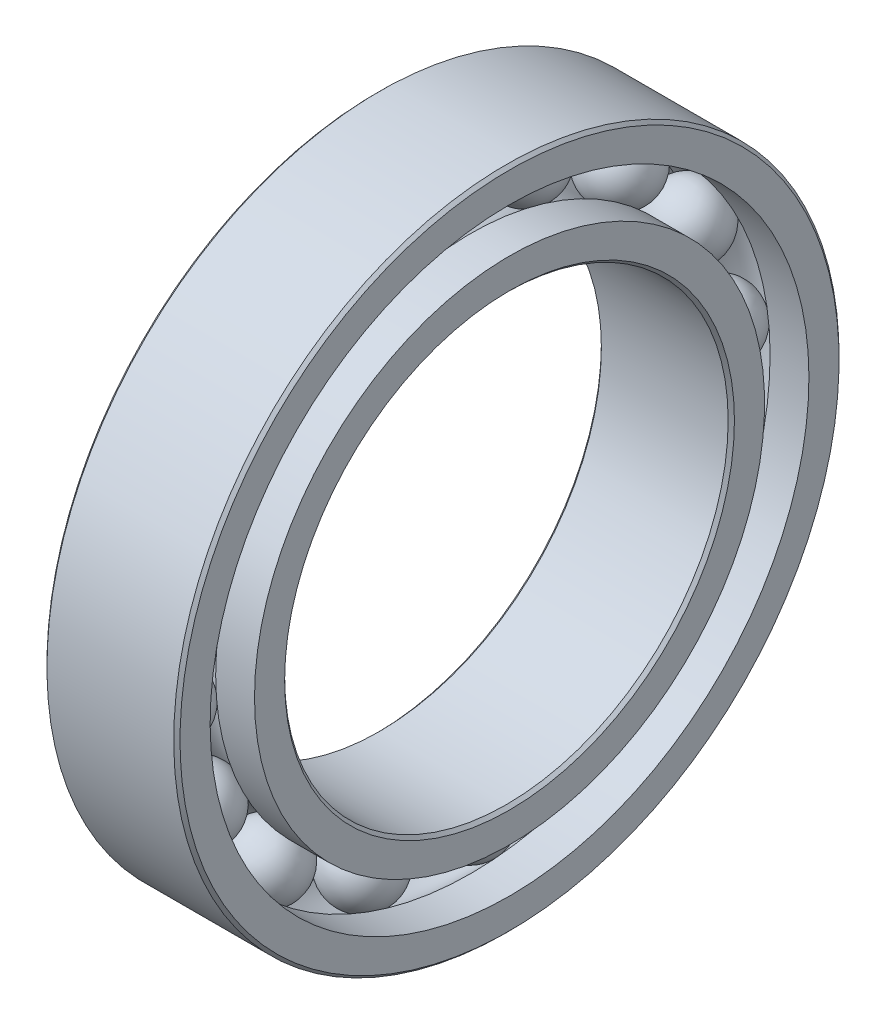
ISO-10303-21;
HEADER;
FILE_DESCRIPTION(('STEP AP214'),'2;1');
FILE_NAME('part.step','',(''),(''),'','','');
FILE_SCHEMA(('AUTOMOTIVE_DESIGN { 1 0 10303 214 1 1 1 1 }'));
ENDSEC;
DATA;
#1=APPLICATION_CONTEXT('core data for automotive mechanical design processes');
#2=APPLICATION_PROTOCOL_DEFINITION('international standard','automotive_design',2000,#1);
#3=PRODUCT_CONTEXT('',#1,'mechanical');
#4=PRODUCT('Part','Part','',(#3));
#5=PRODUCT_RELATED_PRODUCT_CATEGORY('part','',(#4));
#6=PRODUCT_DEFINITION_FORMATION('','',#4);
#7=PRODUCT_DEFINITION_CONTEXT('part definition',#1,'design');
#8=PRODUCT_DEFINITION('design','',#6,#7);
#9=PRODUCT_DEFINITION_SHAPE('','',#8);
#10=(LENGTH_UNIT() NAMED_UNIT(*) SI_UNIT(.MILLI.,.METRE.));
#11=(NAMED_UNIT(*) PLANE_ANGLE_UNIT() SI_UNIT($,.RADIAN.));
#12=(NAMED_UNIT(*) SI_UNIT($,.STERADIAN.) SOLID_ANGLE_UNIT());
#13=UNCERTAINTY_MEASURE_WITH_UNIT(LENGTH_MEASURE(1.E-05),#10,'distance_accuracy_value','');
#14=(GEOMETRIC_REPRESENTATION_CONTEXT(3) GLOBAL_UNCERTAINTY_ASSIGNED_CONTEXT((#13)) GLOBAL_UNIT_ASSIGNED_CONTEXT((#10,
#11,#12)) REPRESENTATION_CONTEXT('',''));
#15=CARTESIAN_POINT('',(0.,0.,0.));
#16=DIRECTION('',(0.,0.,1.));
#17=DIRECTION('',(1.,0.,0.));
#18=AXIS2_PLACEMENT_3D('',#15,#16,#17);
#19=CARTESIAN_POINT('',(0.,-0.596345633296358,6.22148470107003));
#20=DIRECTION('',(0.,0.0044666603108157,0.999990024423078));
#21=DIRECTION('',(0.,0.999990024423078,-0.0044666603108157));
#22=AXIS2_PLACEMENT_3D('',#19,#20,#21);
#23=SPHERICAL_SURFACE('',#22,0.8);
#24=CARTESIAN_POINT('',(0.,-0.592772305047705,7.02147672060849));
#25=VERTEX_POINT('',#24);
#26=VERTEX_LOOP('',#25);
#27=FACE_BOUND('',#26,.T.);
#28=ADVANCED_FACE('P0_F13',(#27),#23,.T.);
#29=CLOSED_SHELL('',(#28));
#30=MANIFOLD_SOLID_BREP('P0_B1',#29);
#31=CARTESIAN_POINT('',(0.,-2.93181064471818,5.51969078332645));
#32=DIRECTION('',(0.,-0.378552958840933,0.925579633177381));
#33=DIRECTION('',(0.,0.925579633177381,0.378552958840933));
#34=AXIS2_PLACEMENT_3D('',#31,#32,#33);
#35=SPHERICAL_SURFACE('',#34,0.8);
#36=CARTESIAN_POINT('',(0.,-3.23465301179092,6.26015448986835));
#37=VERTEX_POINT('',#36);
#38=VERTEX_LOOP('',#37);
#39=FACE_BOUND('',#38,.T.);
#40=ADVANCED_FACE('P1_F13',(#39),#35,.T.);
#41=CLOSED_SHELL('',(#40));
#42=MANIFOLD_SOLID_BREP('P1_B1',#41);
#43=CARTESIAN_POINT('',(0.,-4.82093406241116,3.97757397994123));
#44=DIRECTION('',(0.,-0.703941321596267,0.710258133180678));
#45=DIRECTION('',(0.,0.710258133180678,0.703941321596267));
#46=AXIS2_PLACEMENT_3D('',#43,#44,#45);
#47=SPHERICAL_SURFACE('',#46,0.8);
#48=CARTESIAN_POINT('',(0.,-5.38408711968817,4.54578048648577));
#49=VERTEX_POINT('',#48);
#50=VERTEX_LOOP('',#49);
#51=FACE_BOUND('',#50,.T.);
#52=ADVANCED_FACE('P2_F13',(#51),#47,.T.);
#53=CLOSED_SHELL('',(#52));
#54=MANIFOLD_SOLID_BREP('P2_B1',#53);
#55=CARTESIAN_POINT('',(0.,-5.97611397097814,1.82990759490788));
#56=DIRECTION('',(0.,-0.92216099938254,0.386806270913226));
#57=DIRECTION('',(0.,0.386806270913226,0.92216099938254));
#58=AXIS2_PLACEMENT_3D('',#55,#56,#57);
#59=SPHERICAL_SURFACE('',#58,0.8);
#60=CARTESIAN_POINT('',(0.,-6.71384277048417,2.13935261163846));
#61=VERTEX_POINT('',#60);
#62=VERTEX_LOOP('',#61);
#63=FACE_BOUND('',#62,.T.);
#64=ADVANCED_FACE('P3_F13',(#63),#59,.T.);
#65=CLOSED_SHELL('',(#64));
#66=MANIFOLD_SOLID_BREP('P3_B1',#65);
#67=CARTESIAN_POINT('',(0.,-6.22148470107175,-0.596345633296544));
#68=DIRECTION('',(0.,-0.999990024423096,0.00446666030681287));
#69=DIRECTION('',(0.,0.00446666030681287,0.999990024423096));
#70=AXIS2_PLACEMENT_3D('',#67,#68,#69);
#71=SPHERICAL_SURFACE('',#70,0.8);
#72=CARTESIAN_POINT('',(0.,-7.02147672061023,-0.592772305051093));
#73=VERTEX_POINT('',#72);
#74=VERTEX_LOOP('',#73);
#75=FACE_BOUND('',#74,.T.);
#76=ADVANCED_FACE('P4_F13',(#75),#71,.T.);
#77=CLOSED_SHELL('',(#76));
#78=MANIFOLD_SOLID_BREP('P4_B1',#77);
#79=CARTESIAN_POINT('',(0.,-5.51969078332644,-2.9318106447182));
#80=DIRECTION('',(0.,-0.92557963317738,-0.378552958840936));
#81=DIRECTION('',(0.,-0.378552958840936,0.92557963317738));
#82=AXIS2_PLACEMENT_3D('',#79,#80,#81);
#83=SPHERICAL_SURFACE('',#82,0.8);
#84=CARTESIAN_POINT('',(0.,-6.26015448986834,-3.23465301179094));
#85=VERTEX_POINT('',#84);
#86=VERTEX_LOOP('',#85);
#87=FACE_BOUND('',#86,.T.);
#88=ADVANCED_FACE('P5_F13',(#87),#83,.T.);
#89=CLOSED_SHELL('',(#88));
#90=MANIFOLD_SOLID_BREP('P5_B1',#89);
#91=CARTESIAN_POINT('',(0.,-3.97757397994121,-4.82093406241117));
#92=DIRECTION('',(0.,-0.710258133180675,-0.703941321596269));
#93=DIRECTION('',(0.,-0.703941321596269,0.710258133180675));
#94=AXIS2_PLACEMENT_3D('',#91,#92,#93);
#95=SPHERICAL_SURFACE('',#94,0.8);
#96=CARTESIAN_POINT('',(0.,-4.54578048648576,-5.38408711968819));
#97=VERTEX_POINT('',#96);
#98=VERTEX_LOOP('',#97);
#99=FACE_BOUND('',#98,.T.);
#100=ADVANCED_FACE('P6_F13',(#99),#95,.T.);
#101=CLOSED_SHELL('',(#100));
#102=MANIFOLD_SOLID_BREP('P6_B1',#101);
#103=CARTESIAN_POINT('',(0.,-1.82990759490786,-5.97611397097815));
#104=DIRECTION('',(0.,-0.386806270913223,-0.922160999382541));
#105=DIRECTION('',(0.,-0.922160999382541,0.386806270913223));
#106=AXIS2_PLACEMENT_3D('',#103,#104,#105);
#107=SPHERICAL_SURFACE('',#106,0.8);
#108=CARTESIAN_POINT('',(0.,-2.13935261163844,-6.71384277048418));
#109=VERTEX_POINT('',#108);
#110=VERTEX_LOOP('',#109);
#111=FACE_BOUND('',#110,.T.);
#112=ADVANCED_FACE('P7_F13',(#111),#107,.T.);
#113=CLOSED_SHELL('',(#112));
#114=MANIFOLD_SOLID_BREP('P7_B1',#113);
#115=CARTESIAN_POINT('',(0.,0.596345633296565,-6.22148470107175));
#116=DIRECTION('',(0.,-0.00446666030680938,-0.999990024423096));
#117=DIRECTION('',(0.,-0.999990024423096,0.00446666030680938));
#118=AXIS2_PLACEMENT_3D('',#115,#116,#117);
#119=SPHERICAL_SURFACE('',#118,0.8);
#120=CARTESIAN_POINT('',(0.,0.592772305051118,-7.02147672061022));
#121=VERTEX_POINT('',#120);
#122=VERTEX_LOOP('',#121);
#123=FACE_BOUND('',#122,.T.);
#124=ADVANCED_FACE('P8_F13',(#123),#119,.T.);
#125=CLOSED_SHELL('',(#124));
#126=MANIFOLD_SOLID_BREP('P8_B1',#125);
#127=CARTESIAN_POINT('',(0.,2.93181064471821,-5.51969078332642));
#128=DIRECTION('',(0.,0.378552958840939,-0.925579633177378));
#129=DIRECTION('',(0.,-0.925579633177378,-0.378552958840939));
#130=AXIS2_PLACEMENT_3D('',#127,#128,#129);
#131=SPHERICAL_SURFACE('',#130,0.8);
#132=CARTESIAN_POINT('',(0.,3.23465301179096,-6.26015448986833));
#133=VERTEX_POINT('',#132);
#134=VERTEX_LOOP('',#133);
#135=FACE_BOUND('',#134,.T.);
#136=ADVANCED_FACE('P9_F13',(#135),#131,.T.);
#137=CLOSED_SHELL('',(#136));
#138=MANIFOLD_SOLID_BREP('P9_B1',#137);
#139=CARTESIAN_POINT('',(0.,4.82093406241119,-3.9775739799412));
#140=DIRECTION('',(0.,0.703941321596272,-0.710258133180673));
#141=DIRECTION('',(0.,-0.710258133180673,-0.703941321596272));
#142=AXIS2_PLACEMENT_3D('',#139,#140,#141);
#143=SPHERICAL_SURFACE('',#142,0.8);
#144=CARTESIAN_POINT('',(0.,5.3840871196882,-4.54578048648574));
#145=VERTEX_POINT('',#144);
#146=VERTEX_LOOP('',#145);
#147=FACE_BOUND('',#146,.T.);
#148=ADVANCED_FACE('P10_F13',(#147),#143,.T.);
#149=CLOSED_SHELL('',(#148));
#150=MANIFOLD_SOLID_BREP('P10_B1',#149);
#151=CARTESIAN_POINT('',(0.,5.9761139709765,-1.82990759490733));
#152=DIRECTION('',(0.,0.922160999380995,-0.386806270916907));
#153=DIRECTION('',(0.,-0.386806270916907,-0.922160999380995));
#154=AXIS2_PLACEMENT_3D('',#151,#152,#153);
#155=SPHERICAL_SURFACE('',#154,0.8);
#156=CARTESIAN_POINT('',(0.,6.7138427704813,-2.13935261164085));
#157=VERTEX_POINT('',#156);
#158=VERTEX_LOOP('',#157);
#159=FACE_BOUND('',#158,.T.);
#160=ADVANCED_FACE('P11_F13',(#159),#155,.T.);
#161=CLOSED_SHELL('',(#160));
#162=MANIFOLD_SOLID_BREP('P11_B1',#161);
#163=CARTESIAN_POINT('',(0.,6.22148470107175,0.596345633296587));
#164=DIRECTION('',(0.,0.999990024423096,-0.00446666030680589));
#165=DIRECTION('',(0.,-0.00446666030680589,-0.999990024423096));
#166=AXIS2_PLACEMENT_3D('',#163,#164,#165);
#167=SPHERICAL_SURFACE('',#166,0.8);
#168=CARTESIAN_POINT('',(0.,7.02147672061022,0.592772305051142));
#169=VERTEX_POINT('',#168);
#170=VERTEX_LOOP('',#169);
#171=FACE_BOUND('',#170,.T.);
#172=ADVANCED_FACE('P12_F13',(#171),#167,.T.);
#173=CLOSED_SHELL('',(#172));
#174=MANIFOLD_SOLID_BREP('P12_B1',#173);
#175=CARTESIAN_POINT('',(0.,5.51969078332642,2.93181064471823));
#176=DIRECTION('',(0.,0.925579633177377,0.378552958840942));
#177=DIRECTION('',(0.,0.378552958840942,-0.925579633177377));
#178=AXIS2_PLACEMENT_3D('',#175,#176,#177);
#179=SPHERICAL_SURFACE('',#178,0.8);
#180=CARTESIAN_POINT('',(0.,6.26015448986832,3.23465301179098));
#181=VERTEX_POINT('',#180);
#182=VERTEX_LOOP('',#181);
#183=FACE_BOUND('',#182,.T.);
#184=ADVANCED_FACE('P13_F13',(#183),#179,.T.);
#185=CLOSED_SHELL('',(#184));
#186=MANIFOLD_SOLID_BREP('P13_B1',#185);
#187=CARTESIAN_POINT('',(0.,3.97757397994118,4.8209340624112));
#188=DIRECTION('',(0.,0.71025813318067,0.703941321596274));
#189=DIRECTION('',(0.,0.703941321596274,-0.71025813318067));
#190=AXIS2_PLACEMENT_3D('',#187,#188,#189);
#191=SPHERICAL_SURFACE('',#190,0.8);
#192=CARTESIAN_POINT('',(0.,4.54578048648572,5.38408711968822));
#193=VERTEX_POINT('',#192);
#194=VERTEX_LOOP('',#193);
#195=FACE_BOUND('',#194,.T.);
#196=ADVANCED_FACE('P14_F13',(#195),#191,.T.);
#197=CLOSED_SHELL('',(#196));
#198=MANIFOLD_SOLID_BREP('P14_B1',#197);
#199=CARTESIAN_POINT('',(0.,1.82990759490781,5.97611397097816));
#200=DIRECTION('',(0.,0.386806270913216,0.922160999382544));
#201=DIRECTION('',(0.,0.922160999382544,-0.386806270913216));
#202=AXIS2_PLACEMENT_3D('',#199,#200,#201);
#203=SPHERICAL_SURFACE('',#202,0.8);
#204=CARTESIAN_POINT('',(0.,2.13935261163839,6.7138427704842));
#205=VERTEX_POINT('',#204);
#206=VERTEX_LOOP('',#205);
#207=FACE_BOUND('',#206,.T.);
#208=ADVANCED_FACE('P15_F12',(#207),#203,.T.);
#209=CLOSED_SHELL('',(#208));
#210=MANIFOLD_SOLID_BREP('P15_B1',#209);
#211=CARTESIAN_POINT('',(0.,0.,0.));
#212=DIRECTION('',(-1.,0.,0.));
#213=DIRECTION('',(0.,0.,1.));
#214=AXIS2_PLACEMENT_3D('',#211,#212,#213);
#215=TOROIDAL_SURFACE('',#214,6.25,0.8);
#216=CARTESIAN_POINT('',(0.624499799839839,0.,0.));
#217=DIRECTION('',(-1.,0.,0.));
#218=DIRECTION('',(0.,0.,1.));
#219=AXIS2_PLACEMENT_3D('',#216,#217,#218);
#220=CIRCLE('',#219,5.75);
#221=CARTESIAN_POINT('',(0.624499799839839,0.,5.75));
#222=VERTEX_POINT('',#221);
#223=EDGE_CURVE('P16_E43',#222,#222,#220,.T.);
#224=ORIENTED_EDGE('',*,*,#223,.T.);
#225=EDGE_LOOP('',(#224));
#226=FACE_BOUND('',#225,.T.);
#227=CARTESIAN_POINT('',(-0.62449979983984,0.,0.));
#228=DIRECTION('',(-1.,0.,0.));
#229=DIRECTION('',(0.,0.,1.));
#230=AXIS2_PLACEMENT_3D('',#227,#228,#229);
#231=CIRCLE('',#230,5.75);
#232=CARTESIAN_POINT('',(-0.62449979983984,0.,5.75));
#233=VERTEX_POINT('',#232);
#234=EDGE_CURVE('P16_E10',#233,#233,#231,.T.);
#235=ORIENTED_EDGE('',*,*,#234,.F.);
#236=EDGE_LOOP('',(#235));
#237=FACE_BOUND('',#236,.T.);
#238=ADVANCED_FACE('P16_F15',(#226,#237),#215,.F.);
#239=CARTESIAN_POINT('',(-1.5,0.,0.));
#240=DIRECTION('',(-1.,0.,0.));
#241=DIRECTION('',(0.,0.,1.));
#242=AXIS2_PLACEMENT_3D('',#239,#240,#241);
#243=CYLINDRICAL_SURFACE('',#242,5.75);
#244=CARTESIAN_POINT('',(-1.5,0.,0.));
#245=DIRECTION('',(-1.,0.,0.));
#246=DIRECTION('',(0.,0.,1.));
#247=AXIS2_PLACEMENT_3D('',#244,#245,#246);
#248=CIRCLE('',#247,5.75);
#249=CARTESIAN_POINT('',(-1.5,0.,5.75));
#250=VERTEX_POINT('',#249);
#251=EDGE_CURVE('P16_E21',#250,#250,#248,.T.);
#252=ORIENTED_EDGE('',*,*,#251,.F.);
#253=EDGE_LOOP('',(#252));
#254=FACE_BOUND('',#253,.T.);
#255=ORIENTED_EDGE('',*,*,#234,.T.);
#256=EDGE_LOOP('',(#255));
#257=FACE_BOUND('',#256,.T.);
#258=ADVANCED_FACE('P16_F82',(#254,#257),#243,.T.);
#259=CARTESIAN_POINT('',(-1.5,0.,0.));
#260=DIRECTION('',(-1.,0.,0.));
#261=DIRECTION('',(0.,0.,1.));
#262=AXIS2_PLACEMENT_3D('',#259,#260,#261);
#263=PLANE('',#262);
#264=ORIENTED_EDGE('',*,*,#251,.T.);
#265=EDGE_LOOP('',(#264));
#266=FACE_BOUND('',#265,.T.);
#267=CARTESIAN_POINT('',(-1.5,0.,0.));
#268=DIRECTION('',(-1.,0.,0.));
#269=DIRECTION('',(0.,0.,1.));
#270=AXIS2_PLACEMENT_3D('',#267,#268,#269);
#271=CIRCLE('',#270,5.07071067811865);
#272=CARTESIAN_POINT('',(-1.5,0.,5.07071067811865));
#273=VERTEX_POINT('',#272);
#274=EDGE_CURVE('P16_E25',#273,#273,#271,.T.);
#275=ORIENTED_EDGE('',*,*,#274,.F.);
#276=EDGE_LOOP('',(#275));
#277=FACE_BOUND('',#276,.T.);
#278=ADVANCED_FACE('P16_F75',(#266,#277),#263,.T.);
#279=CARTESIAN_POINT('',(-1.42928932188135,0.,0.));
#280=DIRECTION('',(-1.,0.,0.));
#281=DIRECTION('',(0.,0.,1.));
#282=AXIS2_PLACEMENT_3D('',#279,#280,#281);
#283=CONICAL_SURFACE('',#282,5.,0.785398163397447);
#284=ORIENTED_EDGE('',*,*,#274,.T.);
#285=EDGE_LOOP('',(#284));
#286=FACE_BOUND('',#285,.T.);
#287=CARTESIAN_POINT('',(-1.42928932188135,0.,0.));
#288=DIRECTION('',(-1.,0.,0.));
#289=DIRECTION('',(0.,0.,1.));
#290=AXIS2_PLACEMENT_3D('',#287,#288,#289);
#291=CIRCLE('',#290,5.);
#292=CARTESIAN_POINT('',(-1.42928932188135,0.,5.));
#293=VERTEX_POINT('',#292);
#294=EDGE_CURVE('P16_E29',#293,#293,#291,.T.);
#295=ORIENTED_EDGE('',*,*,#294,.F.);
#296=EDGE_LOOP('',(#295));
#297=FACE_BOUND('',#296,.T.);
#298=ADVANCED_FACE('P16_F70',(#286,#297),#283,.F.);
#299=CARTESIAN_POINT('',(-1.5,0.,0.));
#300=DIRECTION('',(-1.,0.,0.));
#301=DIRECTION('',(0.,0.,1.));
#302=AXIS2_PLACEMENT_3D('',#299,#300,#301);
#303=CYLINDRICAL_SURFACE('',#302,5.);
#304=CARTESIAN_POINT('',(1.42928932188135,0.,0.));
#305=DIRECTION('',(-1.,0.,0.));
#306=DIRECTION('',(0.,0.,1.));
#307=AXIS2_PLACEMENT_3D('',#304,#305,#306);
#308=CIRCLE('',#307,5.);
#309=CARTESIAN_POINT('',(1.42928932188135,0.,5.));
#310=VERTEX_POINT('',#309);
#311=EDGE_CURVE('P16_E34',#310,#310,#308,.T.);
#312=ORIENTED_EDGE('',*,*,#311,.F.);
#313=EDGE_LOOP('',(#312));
#314=FACE_BOUND('',#313,.T.);
#315=ORIENTED_EDGE('',*,*,#294,.T.);
#316=EDGE_LOOP('',(#315));
#317=FACE_BOUND('',#316,.T.);
#318=ADVANCED_FACE('P16_F64',(#314,#317),#303,.F.);
#319=CARTESIAN_POINT('',(1.42928932188135,0.,0.));
#320=DIRECTION('',(1.,0.,0.));
#321=DIRECTION('',(0.,0.,-1.));
#322=AXIS2_PLACEMENT_3D('',#319,#320,#321);
#323=CONICAL_SURFACE('',#322,5.,0.785398163397448);
#324=CARTESIAN_POINT('',(1.5,0.,0.));
#325=DIRECTION('',(-1.,0.,0.));
#326=DIRECTION('',(0.,0.,1.));
#327=AXIS2_PLACEMENT_3D('',#324,#325,#326);
#328=CIRCLE('',#327,5.07071067811865);
#329=CARTESIAN_POINT('',(1.5,0.,5.07071067811865));
#330=VERTEX_POINT('',#329);
#331=EDGE_CURVE('P16_E37',#330,#330,#328,.T.);
#332=ORIENTED_EDGE('',*,*,#331,.F.);
#333=EDGE_LOOP('',(#332));
#334=FACE_BOUND('',#333,.T.);
#335=ORIENTED_EDGE('',*,*,#311,.T.);
#336=EDGE_LOOP('',(#335));
#337=FACE_BOUND('',#336,.T.);
#338=ADVANCED_FACE('P16_F58',(#334,#337),#323,.F.);
#339=CARTESIAN_POINT('',(1.5,0.,0.));
#340=DIRECTION('',(-1.,0.,0.));
#341=DIRECTION('',(0.,0.,1.));
#342=AXIS2_PLACEMENT_3D('',#339,#340,#341);
#343=PLANE('',#342);
#344=CARTESIAN_POINT('',(1.5,0.,0.));
#345=DIRECTION('',(-1.,0.,0.));
#346=DIRECTION('',(0.,0.,1.));
#347=AXIS2_PLACEMENT_3D('',#344,#345,#346);
#348=CIRCLE('',#347,5.75);
#349=CARTESIAN_POINT('',(1.5,0.,5.75));
#350=VERTEX_POINT('',#349);
#351=EDGE_CURVE('P16_E40',#350,#350,#348,.T.);
#352=ORIENTED_EDGE('',*,*,#351,.F.);
#353=EDGE_LOOP('',(#352));
#354=FACE_BOUND('',#353,.T.);
#355=ORIENTED_EDGE('',*,*,#331,.T.);
#356=EDGE_LOOP('',(#355));
#357=FACE_BOUND('',#356,.T.);
#358=ADVANCED_FACE('P16_F52',(#354,#357),#343,.F.);
#359=CARTESIAN_POINT('',(-1.5,0.,0.));
#360=DIRECTION('',(-1.,0.,0.));
#361=DIRECTION('',(0.,0.,1.));
#362=AXIS2_PLACEMENT_3D('',#359,#360,#361);
#363=CYLINDRICAL_SURFACE('',#362,5.75);
#364=ORIENTED_EDGE('',*,*,#223,.F.);
#365=EDGE_LOOP('',(#364));
#366=FACE_BOUND('',#365,.T.);
#367=ORIENTED_EDGE('',*,*,#351,.T.);
#368=EDGE_LOOP('',(#367));
#369=FACE_BOUND('',#368,.T.);
#370=ADVANCED_FACE('P16_F49',(#366,#369),#363,.T.);
#371=CLOSED_SHELL('',(#238,#258,#278,#298,#318,#338,#358,#370));
#372=MANIFOLD_SOLID_BREP('P16_B1',#371);
#373=CARTESIAN_POINT('',(1.5,0.,0.));
#374=DIRECTION('',(-1.,0.,0.));
#375=DIRECTION('',(0.,0.758539082534099,-0.651627547198803));
#376=AXIS2_PLACEMENT_3D('',#373,#374,#375);
#377=CONICAL_SURFACE('',#376,7.42928932188134,0.785398163397448);
#378=CARTESIAN_POINT('',(1.42928932188134,0.,0.));
#379=DIRECTION('',(-1.,0.,0.));
#380=DIRECTION('',(0.,0.758539082534099,-0.651627547198803));
#381=AXIS2_PLACEMENT_3D('',#378,#379,#380);
#382=CIRCLE('',#381,7.5);
#383=CARTESIAN_POINT('',(1.42928932188132,5.68904311900574,-4.88720660399102));
#384=VERTEX_POINT('',#383);
#385=EDGE_CURVE('P17_E10',#384,#384,#382,.T.);
#386=ORIENTED_EDGE('',*,*,#385,.F.);
#387=EDGE_LOOP('',(#386));
#388=FACE_BOUND('',#387,.T.);
#389=CARTESIAN_POINT('',(1.5,0.,0.));
#390=DIRECTION('',(-1.,0.,0.));
#391=DIRECTION('',(0.,0.758539082534099,-0.651627547198803));
#392=AXIS2_PLACEMENT_3D('',#389,#390,#391);
#393=CIRCLE('',#392,7.42928932188134);
#394=CARTESIAN_POINT('',(1.49999999999998,5.63540630610026,-4.8411295782478));
#395=VERTEX_POINT('',#394);
#396=EDGE_CURVE('P17_E43',#395,#395,#393,.T.);
#397=ORIENTED_EDGE('',*,*,#396,.T.);
#398=EDGE_LOOP('',(#397));
#399=FACE_BOUND('',#398,.T.);
#400=ADVANCED_FACE('P17_F15',(#388,#399),#377,.T.);
#401=CARTESIAN_POINT('',(-10.2619693565684,0.,0.));
#402=DIRECTION('',(-1.,0.,0.));
#403=DIRECTION('',(0.,0.758539082534099,-0.651627547198803));
#404=AXIS2_PLACEMENT_3D('',#401,#402,#403);
#405=CYLINDRICAL_SURFACE('',#404,7.5);
#406=CARTESIAN_POINT('',(-1.42928932188134,0.,0.));
#407=DIRECTION('',(-1.,0.,0.));
#408=DIRECTION('',(0.,0.758539082534099,-0.651627547198803));
#409=AXIS2_PLACEMENT_3D('',#406,#407,#408);
#410=CIRCLE('',#409,7.5);
#411=CARTESIAN_POINT('',(-1.42928932188136,5.68904311900573,-4.88720660399102));
#412=VERTEX_POINT('',#411);
#413=EDGE_CURVE('P17_E21',#412,#412,#410,.T.);
#414=ORIENTED_EDGE('',*,*,#413,.F.);
#415=EDGE_LOOP('',(#414));
#416=FACE_BOUND('',#415,.T.);
#417=ORIENTED_EDGE('',*,*,#385,.T.);
#418=EDGE_LOOP('',(#417));
#419=FACE_BOUND('',#418,.T.);
#420=ADVANCED_FACE('P17_F73',(#416,#419),#405,.T.);
#421=CARTESIAN_POINT('',(-1.5,0.,0.));
#422=DIRECTION('',(1.,0.,0.));
#423=DIRECTION('',(0.,-0.758539082534099,0.651627547198803));
#424=AXIS2_PLACEMENT_3D('',#421,#422,#423);
#425=CONICAL_SURFACE('',#424,7.42928932188134,0.785398163397448);
#426=ORIENTED_EDGE('',*,*,#413,.T.);
#427=EDGE_LOOP('',(#426));
#428=FACE_BOUND('',#427,.T.);
#429=CARTESIAN_POINT('',(-1.5,0.,0.));
#430=DIRECTION('',(-1.,0.,0.));
#431=DIRECTION('',(0.,0.758539082534099,-0.651627547198803));
#432=AXIS2_PLACEMENT_3D('',#429,#430,#431);
#433=CIRCLE('',#432,7.42928932188134);
#434=CARTESIAN_POINT('',(-1.50000000000002,5.63540630610024,-4.8411295782478));
#435=VERTEX_POINT('',#434);
#436=EDGE_CURVE('P17_E25',#435,#435,#433,.T.);
#437=ORIENTED_EDGE('',*,*,#436,.F.);
#438=EDGE_LOOP('',(#437));
#439=FACE_BOUND('',#438,.T.);
#440=ADVANCED_FACE('P17_F78',(#428,#439),#425,.T.);
#441=CARTESIAN_POINT('',(-1.49999999999998,-4.39848594359192,-5.12013880710517));
#442=DIRECTION('',(-1.,0.,0.));
#443=DIRECTION('',(0.,0.758539082534099,-0.651627547198803));
#444=AXIS2_PLACEMENT_3D('',#441,#442,#443);
#445=PLANE('',#444);
#446=ORIENTED_EDGE('',*,*,#436,.T.);
#447=EDGE_LOOP('',(#446));
#448=FACE_BOUND('',#447,.T.);
#449=CARTESIAN_POINT('',(-1.5,0.,0.));
#450=DIRECTION('',(-1.,0.,0.));
#451=DIRECTION('',(0.,0.758539082534099,-0.651627547198803));
#452=AXIS2_PLACEMENT_3D('',#449,#450,#451);
#453=CIRCLE('',#452,6.75);
#454=CARTESIAN_POINT('',(-1.50000000000002,5.12013880710516,-4.39848594359192));
#455=VERTEX_POINT('',#454);
#456=EDGE_CURVE('P17_E29',#455,#455,#453,.T.);
#457=ORIENTED_EDGE('',*,*,#456,.F.);
#458=EDGE_LOOP('',(#457));
#459=FACE_BOUND('',#458,.T.);
#460=ADVANCED_FACE('P17_F69',(#448,#459),#445,.T.);
#461=CARTESIAN_POINT('',(-10.2619693565684,0.,0.));
#462=DIRECTION('',(-1.,0.,0.));
#463=DIRECTION('',(0.,0.758539082534099,-0.651627547198803));
#464=AXIS2_PLACEMENT_3D('',#461,#462,#463);
#465=CYLINDRICAL_SURFACE('',#464,6.75);
#466=CARTESIAN_POINT('',(-0.624499799839841,0.,0.));
#467=DIRECTION('',(-1.,0.,0.));
#468=DIRECTION('',(0.,0.758539082534099,-0.651627547198803));
#469=AXIS2_PLACEMENT_3D('',#466,#467,#468);
#470=CIRCLE('',#469,6.75);
#471=CARTESIAN_POINT('',(-0.624499799839859,5.12013880710516,-4.39848594359192));
#472=VERTEX_POINT('',#471);
#473=EDGE_CURVE('P17_E34',#472,#472,#470,.T.);
#474=ORIENTED_EDGE('',*,*,#473,.F.);
#475=EDGE_LOOP('',(#474));
#476=FACE_BOUND('',#475,.T.);
#477=ORIENTED_EDGE('',*,*,#456,.T.);
#478=EDGE_LOOP('',(#477));
#479=FACE_BOUND('',#478,.T.);
#480=ADVANCED_FACE('P17_F62',(#476,#479),#465,.F.);
#481=CARTESIAN_POINT('',(0.,0.,0.));
#482=DIRECTION('',(-1.,0.,0.));
#483=DIRECTION('',(0.,0.758539082534099,-0.651627547198803));
#484=AXIS2_PLACEMENT_3D('',#481,#482,#483);
#485=TOROIDAL_SURFACE('',#484,6.25,0.8);
#486=ORIENTED_EDGE('',*,*,#473,.T.);
#487=EDGE_LOOP('',(#486));
#488=FACE_BOUND('',#487,.T.);
#489=CARTESIAN_POINT('',(0.624499799839841,0.,0.));
#490=DIRECTION('',(-1.,0.,0.));
#491=DIRECTION('',(0.,0.758539082534099,-0.651627547198803));
#492=AXIS2_PLACEMENT_3D('',#489,#490,#491);
#493=CIRCLE('',#492,6.75);
#494=CARTESIAN_POINT('',(0.624499799839823,5.12013880710517,-4.39848594359192));
#495=VERTEX_POINT('',#494);
#496=EDGE_CURVE('P17_E37',#495,#495,#493,.T.);
#497=ORIENTED_EDGE('',*,*,#496,.F.);
#498=EDGE_LOOP('',(#497));
#499=FACE_BOUND('',#498,.T.);
#500=ADVANCED_FACE('P17_F57',(#488,#499),#485,.F.);
#501=CARTESIAN_POINT('',(-10.2619693565684,0.,0.));
#502=DIRECTION('',(-1.,0.,0.));
#503=DIRECTION('',(0.,0.758539082534099,-0.651627547198803));
#504=AXIS2_PLACEMENT_3D('',#501,#502,#503);
#505=CYLINDRICAL_SURFACE('',#504,6.75);
#506=CARTESIAN_POINT('',(1.5,0.,0.));
#507=DIRECTION('',(-1.,0.,0.));
#508=DIRECTION('',(0.,0.758539082534099,-0.651627547198803));
#509=AXIS2_PLACEMENT_3D('',#506,#507,#508);
#510=CIRCLE('',#509,6.75);
#511=CARTESIAN_POINT('',(1.49999999999998,5.12013880710517,-4.39848594359192));
#512=VERTEX_POINT('',#511);
#513=EDGE_CURVE('P17_E40',#512,#512,#510,.T.);
#514=ORIENTED_EDGE('',*,*,#513,.F.);
#515=EDGE_LOOP('',(#514));
#516=FACE_BOUND('',#515,.T.);
#517=ORIENTED_EDGE('',*,*,#496,.T.);
#518=EDGE_LOOP('',(#517));
#519=FACE_BOUND('',#518,.T.);
#520=ADVANCED_FACE('P17_F51',(#516,#519),#505,.F.);
#521=CARTESIAN_POINT('',(1.50000000000002,-4.39848594359191,-5.12013880710516));
#522=DIRECTION('',(-1.,0.,0.));
#523=DIRECTION('',(0.,0.758539082534099,-0.651627547198803));
#524=AXIS2_PLACEMENT_3D('',#521,#522,#523);
#525=PLANE('',#524);
#526=ORIENTED_EDGE('',*,*,#396,.F.);
#527=EDGE_LOOP('',(#526));
#528=FACE_BOUND('',#527,.T.);
#529=ORIENTED_EDGE('',*,*,#513,.T.);
#530=EDGE_LOOP('',(#529));
#531=FACE_BOUND('',#530,.T.);
#532=ADVANCED_FACE('P17_F48',(#528,#531),#525,.F.);
#533=CLOSED_SHELL('',(#400,#420,#440,#460,#480,#500,#520,#532));
#534=MANIFOLD_SOLID_BREP('P17_B1',#533);
#535=ADVANCED_BREP_SHAPE_REPRESENTATION('',(#18,#30,#42,#54,#66,#78,#90,#102,#114,#126,#138,
#150,#162,#174,#186,#198,#210,#372,#534),#14);
#536=SHAPE_DEFINITION_REPRESENTATION(#9,#535);
ENDSEC;
END-ISO-10303-21;
